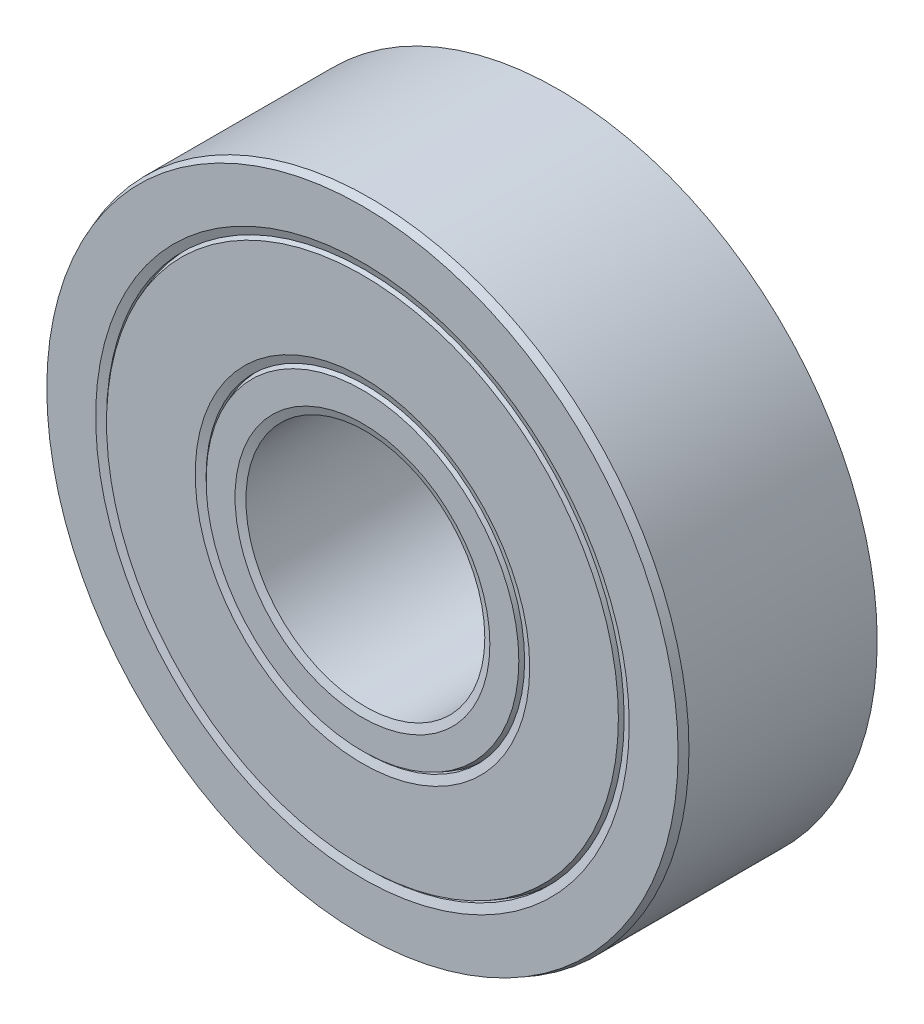
ISO-10303-21;
HEADER;
FILE_DESCRIPTION(('STEP AP214'),'2;1');
FILE_NAME('part.step','',(''),(''),'','','');
FILE_SCHEMA(('AUTOMOTIVE_DESIGN { 1 0 10303 214 1 1 1 1 }'));
ENDSEC;
DATA;
#1=APPLICATION_CONTEXT('core data for automotive mechanical design processes');
#2=APPLICATION_PROTOCOL_DEFINITION('international standard','automotive_design',2000,#1);
#3=PRODUCT_CONTEXT('',#1,'mechanical');
#4=PRODUCT('Part','Part','',(#3));
#5=PRODUCT_RELATED_PRODUCT_CATEGORY('part','',(#4));
#6=PRODUCT_DEFINITION_FORMATION('','',#4);
#7=PRODUCT_DEFINITION_CONTEXT('part definition',#1,'design');
#8=PRODUCT_DEFINITION('design','',#6,#7);
#9=PRODUCT_DEFINITION_SHAPE('','',#8);
#10=(LENGTH_UNIT() NAMED_UNIT(*) SI_UNIT(.MILLI.,.METRE.));
#11=(NAMED_UNIT(*) PLANE_ANGLE_UNIT() SI_UNIT($,.RADIAN.));
#12=(NAMED_UNIT(*) SI_UNIT($,.STERADIAN.) SOLID_ANGLE_UNIT());
#13=UNCERTAINTY_MEASURE_WITH_UNIT(LENGTH_MEASURE(1.E-05),#10,'distance_accuracy_value','');
#14=(GEOMETRIC_REPRESENTATION_CONTEXT(3) GLOBAL_UNCERTAINTY_ASSIGNED_CONTEXT((#13)) GLOBAL_UNIT_ASSIGNED_CONTEXT((#10,
#11,#12)) REPRESENTATION_CONTEXT('',''));
#15=CARTESIAN_POINT('',(0.,0.,0.));
#16=DIRECTION('',(0.,0.,1.));
#17=DIRECTION('',(1.,0.,0.));
#18=AXIS2_PLACEMENT_3D('',#15,#16,#17);
#19=CARTESIAN_POINT('',(0.,0.,0.));
#20=DIRECTION('',(0.,0.,1.));
#21=DIRECTION('',(1.,0.,0.));
#22=AXIS2_PLACEMENT_3D('',#19,#20,#21);
#23=CYLINDRICAL_SURFACE('',#22,8.);
#24=CARTESIAN_POINT('',(0.,0.,0.0727940468532393));
#25=DIRECTION('',(0.,0.,1.));
#26=DIRECTION('',(1.,0.,0.));
#27=AXIS2_PLACEMENT_3D('',#24,#25,#26);
#28=CIRCLE('',#27,8.);
#29=CARTESIAN_POINT('',(8.,0.,0.0727940468532393));
#30=VERTEX_POINT('',#29);
#31=EDGE_CURVE('E74',#30,#30,#28,.T.);
#32=ORIENTED_EDGE('',*,*,#31,.T.);
#33=EDGE_LOOP('',(#32));
#34=FACE_BOUND('',#33,.T.);
#35=CARTESIAN_POINT('',(0.,0.,4.79999999999999));
#36=DIRECTION('',(0.,0.,1.));
#37=DIRECTION('',(1.,0.,0.));
#38=AXIS2_PLACEMENT_3D('',#35,#36,#37);
#39=CIRCLE('',#38,8.);
#40=CARTESIAN_POINT('',(8.,0.,4.79999999999999));
#41=VERTEX_POINT('',#40);
#42=EDGE_CURVE('E77',#41,#41,#39,.F.);
#43=ORIENTED_EDGE('',*,*,#42,.T.);
#44=EDGE_LOOP('',(#43));
#45=FACE_BOUND('',#44,.T.);
#46=ADVANCED_FACE('F47',(#34,#45),#23,.T.);
#47=CARTESIAN_POINT('',(0.,0.,0.));
#48=DIRECTION('',(0.,0.,1.));
#49=DIRECTION('',(1.,0.,0.));
#50=AXIS2_PLACEMENT_3D('',#47,#48,#49);
#51=PLANE('',#50);
#52=CARTESIAN_POINT('',(0.,0.,0.));
#53=DIRECTION('',(0.,0.,1.));
#54=DIRECTION('',(1.,0.,0.));
#55=AXIS2_PLACEMENT_3D('',#52,#53,#54);
#56=CIRCLE('',#55,7.8);
#57=CARTESIAN_POINT('',(7.8,0.,0.));
#58=VERTEX_POINT('',#57);
#59=EDGE_CURVE('E68',#58,#58,#56,.F.);
#60=ORIENTED_EDGE('',*,*,#59,.T.);
#61=EDGE_LOOP('',(#60));
#62=FACE_BOUND('',#61,.T.);
#63=CARTESIAN_POINT('',(0.,0.,0.));
#64=DIRECTION('',(0.,0.,1.));
#65=DIRECTION('',(1.,0.,0.));
#66=AXIS2_PLACEMENT_3D('',#63,#64,#65);
#67=CIRCLE('',#66,6.57279404685324);
#68=CARTESIAN_POINT('',(6.57279404685324,0.,0.));
#69=VERTEX_POINT('',#68);
#70=EDGE_CURVE('E71',#69,#69,#67,.T.);
#71=ORIENTED_EDGE('',*,*,#70,.T.);
#72=EDGE_LOOP('',(#71));
#73=FACE_BOUND('',#72,.T.);
#74=ADVANCED_FACE('F96',(#62,#73),#51,.F.);
#75=CARTESIAN_POINT('',(0.,0.,5.));
#76=DIRECTION('',(0.,0.,1.));
#77=DIRECTION('',(1.,0.,0.));
#78=AXIS2_PLACEMENT_3D('',#75,#76,#77);
#79=PLANE('',#78);
#80=CARTESIAN_POINT('',(0.,0.,5.));
#81=DIRECTION('',(0.,0.,1.));
#82=DIRECTION('',(1.,0.,0.));
#83=AXIS2_PLACEMENT_3D('',#80,#81,#82);
#84=CIRCLE('',#83,7.92720595314676);
#85=CARTESIAN_POINT('',(7.92720595314676,0.,5.));
#86=VERTEX_POINT('',#85);
#87=EDGE_CURVE('E11',#86,#86,#84,.T.);
#88=ORIENTED_EDGE('',*,*,#87,.T.);
#89=EDGE_LOOP('',(#88));
#90=FACE_BOUND('',#89,.T.);
#91=CARTESIAN_POINT('',(0.,0.,5.));
#92=DIRECTION('',(0.,0.,1.));
#93=DIRECTION('',(1.,0.,0.));
#94=AXIS2_PLACEMENT_3D('',#91,#92,#93);
#95=CIRCLE('',#94,6.7);
#96=CARTESIAN_POINT('',(6.7,0.,5.));
#97=VERTEX_POINT('',#96);
#98=EDGE_CURVE('E55',#97,#97,#95,.F.);
#99=ORIENTED_EDGE('',*,*,#98,.T.);
#100=EDGE_LOOP('',(#99));
#101=FACE_BOUND('',#100,.T.);
#102=ADVANCED_FACE('F102',(#90,#101),#79,.T.);
#103=CARTESIAN_POINT('',(0.,0.,0.));
#104=DIRECTION('',(0.,0.,1.));
#105=DIRECTION('',(1.,0.,0.));
#106=AXIS2_PLACEMENT_3D('',#103,#104,#105);
#107=CYLINDRICAL_SURFACE('',#106,6.5);
#108=CARTESIAN_POINT('',(0.,0.,0.200000000000006));
#109=DIRECTION('',(0.,0.,1.));
#110=DIRECTION('',(1.,0.,0.));
#111=AXIS2_PLACEMENT_3D('',#108,#109,#110);
#112=CIRCLE('',#111,6.5);
#113=CARTESIAN_POINT('',(6.5,0.,0.200000000000006));
#114=VERTEX_POINT('',#113);
#115=EDGE_CURVE('E59',#114,#114,#112,.F.);
#116=ORIENTED_EDGE('',*,*,#115,.T.);
#117=EDGE_LOOP('',(#116));
#118=FACE_BOUND('',#117,.T.);
#119=CARTESIAN_POINT('',(0.,0.,4.92720595314676));
#120=DIRECTION('',(0.,0.,1.));
#121=DIRECTION('',(1.,0.,0.));
#122=AXIS2_PLACEMENT_3D('',#119,#120,#121);
#123=CIRCLE('',#122,6.5);
#124=CARTESIAN_POINT('',(6.5,0.,4.92720595314676));
#125=VERTEX_POINT('',#124);
#126=EDGE_CURVE('E63',#125,#125,#123,.T.);
#127=ORIENTED_EDGE('',*,*,#126,.T.);
#128=EDGE_LOOP('',(#127));
#129=FACE_BOUND('',#128,.T.);
#130=ADVANCED_FACE('F112',(#118,#129),#107,.F.);
#131=CARTESIAN_POINT('',(0.,0.,0.0727940468532393));
#132=DIRECTION('',(0.,0.,1.));
#133=DIRECTION('',(1.,0.,0.));
#134=AXIS2_PLACEMENT_3D('',#131,#132,#133);
#135=CONICAL_SURFACE('',#134,8.,1.22173047639604);
#136=ORIENTED_EDGE('',*,*,#59,.F.);
#137=EDGE_LOOP('',(#136));
#138=FACE_BOUND('',#137,.T.);
#139=ORIENTED_EDGE('',*,*,#31,.F.);
#140=EDGE_LOOP('',(#139));
#141=FACE_BOUND('',#140,.T.);
#142=ADVANCED_FACE('F91',(#138,#141),#135,.T.);
#143=CARTESIAN_POINT('',(0.,0.,0.));
#144=DIRECTION('',(0.,0.,-1.));
#145=DIRECTION('',(-1.,0.,0.));
#146=AXIS2_PLACEMENT_3D('',#143,#144,#145);
#147=CONICAL_SURFACE('',#146,6.57279404685324,0.349065850398863);
#148=ORIENTED_EDGE('',*,*,#115,.F.);
#149=EDGE_LOOP('',(#148));
#150=FACE_BOUND('',#149,.T.);
#151=ORIENTED_EDGE('',*,*,#70,.F.);
#152=EDGE_LOOP('',(#151));
#153=FACE_BOUND('',#152,.T.);
#154=ADVANCED_FACE('F85',(#150,#153),#147,.F.);
#155=CARTESIAN_POINT('',(0.,0.,5.));
#156=DIRECTION('',(0.,0.,-1.));
#157=DIRECTION('',(-1.,0.,0.));
#158=AXIS2_PLACEMENT_3D('',#155,#156,#157);
#159=CONICAL_SURFACE('',#158,7.92720595314676,0.349065850398867);
#160=ORIENTED_EDGE('',*,*,#42,.F.);
#161=EDGE_LOOP('',(#160));
#162=FACE_BOUND('',#161,.T.);
#163=ORIENTED_EDGE('',*,*,#87,.F.);
#164=EDGE_LOOP('',(#163));
#165=FACE_BOUND('',#164,.T.);
#166=ADVANCED_FACE('F82',(#162,#165),#159,.T.);
#167=CARTESIAN_POINT('',(0.,0.,4.92720595314676));
#168=DIRECTION('',(0.,0.,1.));
#169=DIRECTION('',(1.,0.,0.));
#170=AXIS2_PLACEMENT_3D('',#167,#168,#169);
#171=CONICAL_SURFACE('',#170,6.5,1.22173047639603);
#172=ORIENTED_EDGE('',*,*,#98,.F.);
#173=EDGE_LOOP('',(#172));
#174=FACE_BOUND('',#173,.T.);
#175=ORIENTED_EDGE('',*,*,#126,.F.);
#176=EDGE_LOOP('',(#175));
#177=FACE_BOUND('',#176,.T.);
#178=ADVANCED_FACE('F50',(#174,#177),#171,.F.);
#179=CLOSED_SHELL('',(#46,#74,#102,#130,#142,#154,#166,#178));
#180=MANIFOLD_SOLID_BREP('B2',#179);
#181=CARTESIAN_POINT('',(0.,0.,0.));
#182=DIRECTION('',(0.,0.,1.));
#183=DIRECTION('',(1.,0.,0.));
#184=AXIS2_PLACEMENT_3D('',#181,#182,#183);
#185=CYLINDRICAL_SURFACE('',#184,6.5);
#186=CARTESIAN_POINT('',(0.,0.,0.0727940468532415));
#187=DIRECTION('',(0.,0.,1.));
#188=DIRECTION('',(1.,0.,0.));
#189=AXIS2_PLACEMENT_3D('',#186,#187,#188);
#190=CIRCLE('',#189,6.5);
#191=CARTESIAN_POINT('',(6.5,0.,0.0727940468532415));
#192=VERTEX_POINT('',#191);
#193=EDGE_CURVE('E233',#192,#192,#190,.T.);
#194=ORIENTED_EDGE('',*,*,#193,.T.);
#195=EDGE_LOOP('',(#194));
#196=FACE_BOUND('',#195,.T.);
#197=CARTESIAN_POINT('',(0.,0.,4.8));
#198=DIRECTION('',(0.,0.,1.));
#199=DIRECTION('',(1.,0.,0.));
#200=AXIS2_PLACEMENT_3D('',#197,#198,#199);
#201=CIRCLE('',#200,6.5);
#202=CARTESIAN_POINT('',(6.5,0.,4.8));
#203=VERTEX_POINT('',#202);
#204=EDGE_CURVE('E236',#203,#203,#201,.F.);
#205=ORIENTED_EDGE('',*,*,#204,.T.);
#206=EDGE_LOOP('',(#205));
#207=FACE_BOUND('',#206,.T.);
#208=ADVANCED_FACE('F206',(#196,#207),#185,.T.);
#209=CARTESIAN_POINT('',(0.,0.,0.));
#210=DIRECTION('',(0.,0.,1.));
#211=DIRECTION('',(1.,0.,0.));
#212=AXIS2_PLACEMENT_3D('',#209,#210,#211);
#213=PLANE('',#212);
#214=CARTESIAN_POINT('',(0.,0.,0.));
#215=DIRECTION('',(0.,0.,1.));
#216=DIRECTION('',(1.,0.,0.));
#217=AXIS2_PLACEMENT_3D('',#214,#215,#216);
#218=CIRCLE('',#217,6.3);
#219=CARTESIAN_POINT('',(6.3,0.,0.));
#220=VERTEX_POINT('',#219);
#221=EDGE_CURVE('E227',#220,#220,#218,.F.);
#222=ORIENTED_EDGE('',*,*,#221,.T.);
#223=EDGE_LOOP('',(#222));
#224=FACE_BOUND('',#223,.T.);
#225=CARTESIAN_POINT('',(0.,0.,0.));
#226=DIRECTION('',(0.,0.,1.));
#227=DIRECTION('',(1.,0.,0.));
#228=AXIS2_PLACEMENT_3D('',#225,#226,#227);
#229=CIRCLE('',#228,4.07279404685324);
#230=CARTESIAN_POINT('',(4.07279404685324,0.,0.));
#231=VERTEX_POINT('',#230);
#232=EDGE_CURVE('E230',#231,#231,#229,.T.);
#233=ORIENTED_EDGE('',*,*,#232,.T.);
#234=EDGE_LOOP('',(#233));
#235=FACE_BOUND('',#234,.T.);
#236=ADVANCED_FACE('F255',(#224,#235),#213,.F.);
#237=CARTESIAN_POINT('',(0.,0.,5.));
#238=DIRECTION('',(0.,0.,1.));
#239=DIRECTION('',(1.,0.,0.));
#240=AXIS2_PLACEMENT_3D('',#237,#238,#239);
#241=PLANE('',#240);
#242=CARTESIAN_POINT('',(0.,0.,5.));
#243=DIRECTION('',(0.,0.,1.));
#244=DIRECTION('',(1.,0.,0.));
#245=AXIS2_PLACEMENT_3D('',#242,#243,#244);
#246=CIRCLE('',#245,6.42720595314676);
#247=CARTESIAN_POINT('',(6.42720595314676,0.,5.));
#248=VERTEX_POINT('',#247);
#249=EDGE_CURVE('E46',#248,#248,#246,.T.);
#250=ORIENTED_EDGE('',*,*,#249,.T.);
#251=EDGE_LOOP('',(#250));
#252=FACE_BOUND('',#251,.T.);
#253=CARTESIAN_POINT('',(0.,0.,5.));
#254=DIRECTION('',(0.,0.,1.));
#255=DIRECTION('',(1.,0.,0.));
#256=AXIS2_PLACEMENT_3D('',#253,#254,#255);
#257=CIRCLE('',#256,4.2);
#258=CARTESIAN_POINT('',(4.2,0.,5.));
#259=VERTEX_POINT('',#258);
#260=EDGE_CURVE('E214',#259,#259,#257,.F.);
#261=ORIENTED_EDGE('',*,*,#260,.T.);
#262=EDGE_LOOP('',(#261));
#263=FACE_BOUND('',#262,.T.);
#264=ADVANCED_FACE('F261',(#252,#263),#241,.T.);
#265=CARTESIAN_POINT('',(0.,0.,0.));
#266=DIRECTION('',(0.,0.,1.));
#267=DIRECTION('',(1.,0.,0.));
#268=AXIS2_PLACEMENT_3D('',#265,#266,#267);
#269=CYLINDRICAL_SURFACE('',#268,4.);
#270=CARTESIAN_POINT('',(0.,0.,0.200000000000007));
#271=DIRECTION('',(0.,0.,1.));
#272=DIRECTION('',(1.,0.,0.));
#273=AXIS2_PLACEMENT_3D('',#270,#271,#272);
#274=CIRCLE('',#273,4.);
#275=CARTESIAN_POINT('',(4.,0.,0.200000000000007));
#276=VERTEX_POINT('',#275);
#277=EDGE_CURVE('E218',#276,#276,#274,.F.);
#278=ORIENTED_EDGE('',*,*,#277,.T.);
#279=EDGE_LOOP('',(#278));
#280=FACE_BOUND('',#279,.T.);
#281=CARTESIAN_POINT('',(0.,0.,4.92720595314676));
#282=DIRECTION('',(0.,0.,1.));
#283=DIRECTION('',(1.,0.,0.));
#284=AXIS2_PLACEMENT_3D('',#281,#282,#283);
#285=CIRCLE('',#284,4.);
#286=CARTESIAN_POINT('',(4.,0.,4.92720595314676));
#287=VERTEX_POINT('',#286);
#288=EDGE_CURVE('E222',#287,#287,#285,.T.);
#289=ORIENTED_EDGE('',*,*,#288,.T.);
#290=EDGE_LOOP('',(#289));
#291=FACE_BOUND('',#290,.T.);
#292=ADVANCED_FACE('F271',(#280,#291),#269,.F.);
#293=CARTESIAN_POINT('',(0.,0.,0.0727940468532415));
#294=DIRECTION('',(0.,0.,1.));
#295=DIRECTION('',(1.,0.,0.));
#296=AXIS2_PLACEMENT_3D('',#293,#294,#295);
#297=CONICAL_SURFACE('',#296,6.5,1.22173047639603);
#298=ORIENTED_EDGE('',*,*,#221,.F.);
#299=EDGE_LOOP('',(#298));
#300=FACE_BOUND('',#299,.T.);
#301=ORIENTED_EDGE('',*,*,#193,.F.);
#302=EDGE_LOOP('',(#301));
#303=FACE_BOUND('',#302,.T.);
#304=ADVANCED_FACE('F250',(#300,#303),#297,.T.);
#305=CARTESIAN_POINT('',(0.,0.,0.));
#306=DIRECTION('',(0.,0.,-1.));
#307=DIRECTION('',(-1.,0.,0.));
#308=AXIS2_PLACEMENT_3D('',#305,#306,#307);
#309=CONICAL_SURFACE('',#308,4.07279404685324,0.349065850398864);
#310=ORIENTED_EDGE('',*,*,#277,.F.);
#311=EDGE_LOOP('',(#310));
#312=FACE_BOUND('',#311,.T.);
#313=ORIENTED_EDGE('',*,*,#232,.F.);
#314=EDGE_LOOP('',(#313));
#315=FACE_BOUND('',#314,.T.);
#316=ADVANCED_FACE('F244',(#312,#315),#309,.F.);
#317=CARTESIAN_POINT('',(0.,0.,5.));
#318=DIRECTION('',(0.,0.,-1.));
#319=DIRECTION('',(-1.,0.,0.));
#320=AXIS2_PLACEMENT_3D('',#317,#318,#319);
#321=CONICAL_SURFACE('',#320,6.42720595314676,0.34906585039885);
#322=ORIENTED_EDGE('',*,*,#204,.F.);
#323=EDGE_LOOP('',(#322));
#324=FACE_BOUND('',#323,.T.);
#325=ORIENTED_EDGE('',*,*,#249,.F.);
#326=EDGE_LOOP('',(#325));
#327=FACE_BOUND('',#326,.T.);
#328=ADVANCED_FACE('F241',(#324,#327),#321,.T.);
#329=CARTESIAN_POINT('',(0.,0.,4.92720595314676));
#330=DIRECTION('',(0.,0.,1.));
#331=DIRECTION('',(1.,0.,0.));
#332=AXIS2_PLACEMENT_3D('',#329,#330,#331);
#333=CONICAL_SURFACE('',#332,4.,1.22173047639604);
#334=ORIENTED_EDGE('',*,*,#260,.F.);
#335=EDGE_LOOP('',(#334));
#336=FACE_BOUND('',#335,.T.);
#337=ORIENTED_EDGE('',*,*,#288,.F.);
#338=EDGE_LOOP('',(#337));
#339=FACE_BOUND('',#338,.T.);
#340=ADVANCED_FACE('F209',(#336,#339),#333,.F.);
#341=CLOSED_SHELL('',(#208,#236,#264,#292,#304,#316,#328,#340));
#342=MANIFOLD_SOLID_BREP('B6',#341);
#343=CARTESIAN_POINT('',(0.,0.,5.));
#344=DIRECTION('',(0.,0.,1.));
#345=DIRECTION('',(1.,0.,0.));
#346=AXIS2_PLACEMENT_3D('',#343,#344,#345);
#347=PLANE('',#346);
#348=CARTESIAN_POINT('',(0.,0.,5.));
#349=DIRECTION('',(0.,0.,1.));
#350=DIRECTION('',(1.,0.,0.));
#351=AXIS2_PLACEMENT_3D('',#348,#349,#350);
#352=CIRCLE('',#351,3.20000000000001);
#353=CARTESIAN_POINT('',(3.20000000000001,0.,5.));
#354=VERTEX_POINT('',#353);
#355=EDGE_CURVE('E205',#354,#354,#352,.F.);
#356=ORIENTED_EDGE('',*,*,#355,.T.);
#357=EDGE_LOOP('',(#356));
#358=FACE_BOUND('',#357,.T.);
#359=CARTESIAN_POINT('',(0.,0.,5.));
#360=DIRECTION('',(0.,0.,1.));
#361=DIRECTION('',(1.,0.,0.));
#362=AXIS2_PLACEMENT_3D('',#359,#360,#361);
#363=CIRCLE('',#362,3.92720595314676);
#364=CARTESIAN_POINT('',(3.92720595314676,0.,5.));
#365=VERTEX_POINT('',#364);
#366=EDGE_CURVE('E347',#365,#365,#363,.T.);
#367=ORIENTED_EDGE('',*,*,#366,.T.);
#368=EDGE_LOOP('',(#367));
#369=FACE_BOUND('',#368,.T.);
#370=ADVANCED_FACE('F339',(#358,#369),#347,.T.);
#371=CARTESIAN_POINT('',(0.,0.,0.));
#372=DIRECTION('',(0.,0.,1.));
#373=DIRECTION('',(1.,0.,0.));
#374=AXIS2_PLACEMENT_3D('',#371,#372,#373);
#375=PLANE('',#374);
#376=CARTESIAN_POINT('',(0.,0.,0.));
#377=DIRECTION('',(0.,0.,1.));
#378=DIRECTION('',(1.,0.,0.));
#379=AXIS2_PLACEMENT_3D('',#376,#377,#378);
#380=CIRCLE('',#379,3.07279404685324);
#381=CARTESIAN_POINT('',(3.07279404685324,0.,0.));
#382=VERTEX_POINT('',#381);
#383=EDGE_CURVE('E366',#382,#382,#380,.T.);
#384=ORIENTED_EDGE('',*,*,#383,.T.);
#385=EDGE_LOOP('',(#384));
#386=FACE_BOUND('',#385,.T.);
#387=CARTESIAN_POINT('',(0.,0.,0.));
#388=DIRECTION('',(0.,0.,1.));
#389=DIRECTION('',(1.,0.,0.));
#390=AXIS2_PLACEMENT_3D('',#387,#388,#389);
#391=CIRCLE('',#390,3.8);
#392=CARTESIAN_POINT('',(3.8,0.,0.));
#393=VERTEX_POINT('',#392);
#394=EDGE_CURVE('E369',#393,#393,#391,.F.);
#395=ORIENTED_EDGE('',*,*,#394,.T.);
#396=EDGE_LOOP('',(#395));
#397=FACE_BOUND('',#396,.T.);
#398=ADVANCED_FACE('F373',(#386,#397),#375,.F.);
#399=CARTESIAN_POINT('',(0.,0.,5.));
#400=DIRECTION('',(0.,0.,-1.));
#401=DIRECTION('',(-1.,0.,0.));
#402=AXIS2_PLACEMENT_3D('',#399,#400,#401);
#403=CYLINDRICAL_SURFACE('',#402,4.);
#404=CARTESIAN_POINT('',(0.,0.,0.0727940468532411));
#405=DIRECTION('',(0.,0.,1.));
#406=DIRECTION('',(1.,0.,0.));
#407=AXIS2_PLACEMENT_3D('',#404,#405,#406);
#408=CIRCLE('',#407,4.);
#409=CARTESIAN_POINT('',(4.,0.,0.0727940468532411));
#410=VERTEX_POINT('',#409);
#411=EDGE_CURVE('E351',#410,#410,#408,.T.);
#412=ORIENTED_EDGE('',*,*,#411,.T.);
#413=EDGE_LOOP('',(#412));
#414=FACE_BOUND('',#413,.T.);
#415=CARTESIAN_POINT('',(0.,0.,4.79999999999999));
#416=DIRECTION('',(0.,0.,1.));
#417=DIRECTION('',(1.,0.,0.));
#418=AXIS2_PLACEMENT_3D('',#415,#416,#417);
#419=CIRCLE('',#418,4.);
#420=CARTESIAN_POINT('',(4.,0.,4.79999999999999));
#421=VERTEX_POINT('',#420);
#422=EDGE_CURVE('E355',#421,#421,#419,.F.);
#423=ORIENTED_EDGE('',*,*,#422,.T.);
#424=EDGE_LOOP('',(#423));
#425=FACE_BOUND('',#424,.T.);
#426=ADVANCED_FACE('F383',(#414,#425),#403,.T.);
#427=CARTESIAN_POINT('',(0.,0.,5.));
#428=DIRECTION('',(0.,0.,-1.));
#429=DIRECTION('',(-1.,0.,0.));
#430=AXIS2_PLACEMENT_3D('',#427,#428,#429);
#431=CYLINDRICAL_SURFACE('',#430,3.);
#432=CARTESIAN_POINT('',(0.,0.,0.200000000000002));
#433=DIRECTION('',(0.,0.,1.));
#434=DIRECTION('',(1.,0.,0.));
#435=AXIS2_PLACEMENT_3D('',#432,#433,#434);
#436=CIRCLE('',#435,3.);
#437=CARTESIAN_POINT('',(3.,0.,0.200000000000002));
#438=VERTEX_POINT('',#437);
#439=EDGE_CURVE('E360',#438,#438,#436,.F.);
#440=ORIENTED_EDGE('',*,*,#439,.T.);
#441=EDGE_LOOP('',(#440));
#442=FACE_BOUND('',#441,.T.);
#443=CARTESIAN_POINT('',(0.,0.,4.92720595314676));
#444=DIRECTION('',(0.,0.,1.));
#445=DIRECTION('',(1.,0.,0.));
#446=AXIS2_PLACEMENT_3D('',#443,#444,#445);
#447=CIRCLE('',#446,3.);
#448=CARTESIAN_POINT('',(3.,0.,4.92720595314676));
#449=VERTEX_POINT('',#448);
#450=EDGE_CURVE('E363',#449,#449,#447,.T.);
#451=ORIENTED_EDGE('',*,*,#450,.T.);
#452=EDGE_LOOP('',(#451));
#453=FACE_BOUND('',#452,.T.);
#454=ADVANCED_FACE('F386',(#442,#453),#431,.F.);
#455=CARTESIAN_POINT('',(0.,0.,0.));
#456=DIRECTION('',(0.,0.,-1.));
#457=DIRECTION('',(-1.,0.,0.));
#458=AXIS2_PLACEMENT_3D('',#455,#456,#457);
#459=CONICAL_SURFACE('',#458,3.07279404685324,0.349065850398863);
#460=ORIENTED_EDGE('',*,*,#439,.F.);
#461=EDGE_LOOP('',(#460));
#462=FACE_BOUND('',#461,.T.);
#463=ORIENTED_EDGE('',*,*,#383,.F.);
#464=EDGE_LOOP('',(#463));
#465=FACE_BOUND('',#464,.T.);
#466=ADVANCED_FACE('F379',(#462,#465),#459,.F.);
#467=CARTESIAN_POINT('',(0.,0.,0.0727940468532411));
#468=DIRECTION('',(0.,0.,1.));
#469=DIRECTION('',(1.,0.,0.));
#470=AXIS2_PLACEMENT_3D('',#467,#468,#469);
#471=CONICAL_SURFACE('',#470,4.,1.22173047639603);
#472=ORIENTED_EDGE('',*,*,#394,.F.);
#473=EDGE_LOOP('',(#472));
#474=FACE_BOUND('',#473,.T.);
#475=ORIENTED_EDGE('',*,*,#411,.F.);
#476=EDGE_LOOP('',(#475));
#477=FACE_BOUND('',#476,.T.);
#478=ADVANCED_FACE('F375',(#474,#477),#471,.T.);
#479=CARTESIAN_POINT('',(0.,0.,4.92720595314676));
#480=DIRECTION('',(0.,0.,1.));
#481=DIRECTION('',(1.,0.,0.));
#482=AXIS2_PLACEMENT_3D('',#479,#480,#481);
#483=CONICAL_SURFACE('',#482,3.,1.22173047639604);
#484=ORIENTED_EDGE('',*,*,#355,.F.);
#485=EDGE_LOOP('',(#484));
#486=FACE_BOUND('',#485,.T.);
#487=ORIENTED_EDGE('',*,*,#450,.F.);
#488=EDGE_LOOP('',(#487));
#489=FACE_BOUND('',#488,.T.);
#490=ADVANCED_FACE('F378',(#486,#489),#483,.F.);
#491=CARTESIAN_POINT('',(0.,0.,5.));
#492=DIRECTION('',(0.,0.,-1.));
#493=DIRECTION('',(-1.,0.,0.));
#494=AXIS2_PLACEMENT_3D('',#491,#492,#493);
#495=CONICAL_SURFACE('',#494,3.92720595314676,0.349065850398865);
#496=ORIENTED_EDGE('',*,*,#422,.F.);
#497=EDGE_LOOP('',(#496));
#498=FACE_BOUND('',#497,.T.);
#499=ORIENTED_EDGE('',*,*,#366,.F.);
#500=EDGE_LOOP('',(#499));
#501=FACE_BOUND('',#500,.T.);
#502=ADVANCED_FACE('F342',(#498,#501),#495,.T.);
#503=CLOSED_SHELL('',(#370,#398,#426,#454,#466,#478,#490,#502));
#504=MANIFOLD_SOLID_BREP('B41',#503);
#505=ADVANCED_BREP_SHAPE_REPRESENTATION('',(#18,#180,#342,#504),#14);
#506=SHAPE_DEFINITION_REPRESENTATION(#9,#505);
ENDSEC;
END-ISO-10303-21;
